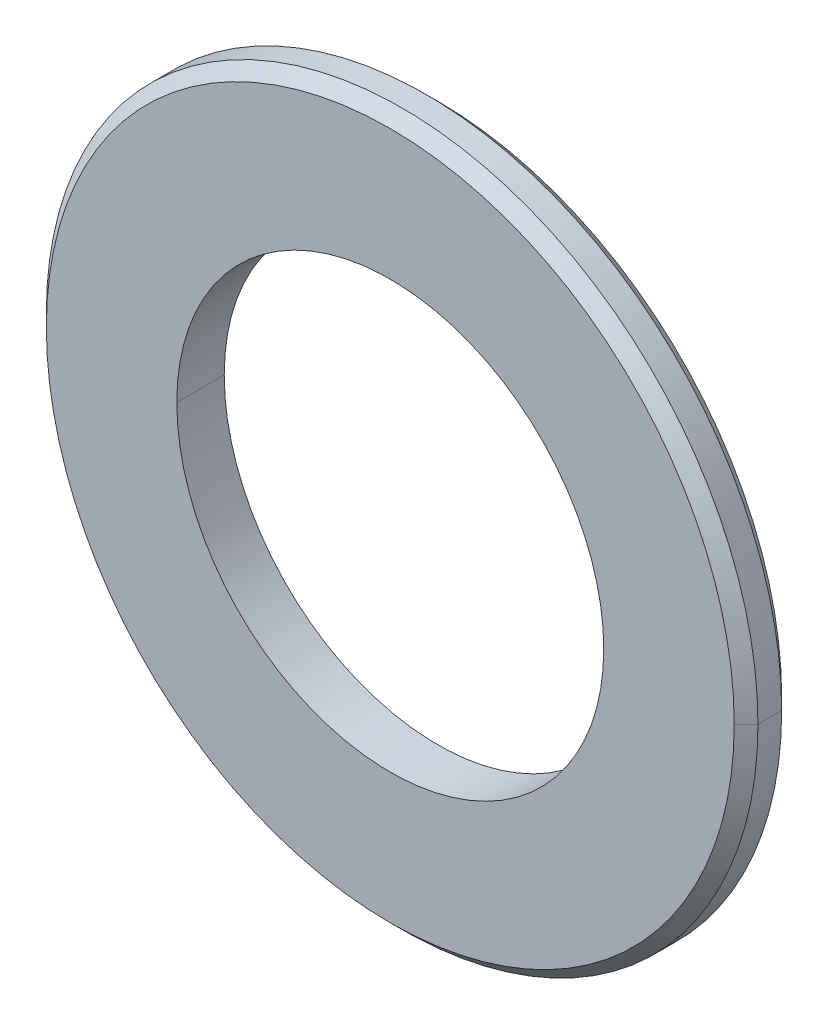
ISO-10303-21;
HEADER;
FILE_DESCRIPTION(('STEP AP214'),'2;1');
FILE_NAME('part.step','',(''),(''),'','','');
FILE_SCHEMA(('AUTOMOTIVE_DESIGN { 1 0 10303 214 1 1 1 1 }'));
ENDSEC;
DATA;
#1=APPLICATION_CONTEXT('core data for automotive mechanical design processes');
#2=APPLICATION_PROTOCOL_DEFINITION('international standard','automotive_design',2000,#1);
#3=PRODUCT_CONTEXT('',#1,'mechanical');
#4=PRODUCT('Part','Part','',(#3));
#5=PRODUCT_RELATED_PRODUCT_CATEGORY('part','',(#4));
#6=PRODUCT_DEFINITION_FORMATION('','',#4);
#7=PRODUCT_DEFINITION_CONTEXT('part definition',#1,'design');
#8=PRODUCT_DEFINITION('design','',#6,#7);
#9=PRODUCT_DEFINITION_SHAPE('','',#8);
#10=(LENGTH_UNIT() NAMED_UNIT(*) SI_UNIT(.MILLI.,.METRE.));
#11=(NAMED_UNIT(*) PLANE_ANGLE_UNIT() SI_UNIT($,.RADIAN.));
#12=(NAMED_UNIT(*) SI_UNIT($,.STERADIAN.) SOLID_ANGLE_UNIT());
#13=UNCERTAINTY_MEASURE_WITH_UNIT(LENGTH_MEASURE(1.E-05),#10,'distance_accuracy_value','');
#14=(GEOMETRIC_REPRESENTATION_CONTEXT(3) GLOBAL_UNCERTAINTY_ASSIGNED_CONTEXT((#13)) GLOBAL_UNIT_ASSIGNED_CONTEXT((#10,
#11,#12)) REPRESENTATION_CONTEXT('',''));
#15=CARTESIAN_POINT('',(0.,0.,0.));
#16=DIRECTION('',(0.,0.,1.));
#17=DIRECTION('',(1.,0.,0.));
#18=AXIS2_PLACEMENT_3D('',#15,#16,#17);
#19=CARTESIAN_POINT('',(0.,0.,1.));
#20=DIRECTION('',(0.,0.,-1.));
#21=DIRECTION('',(-1.,0.,0.));
#22=AXIS2_PLACEMENT_3D('',#19,#20,#21);
#23=CONICAL_SURFACE('',#22,7.25,0.785398163397443);
#24=DIRECTION('',(0.707106781186544,0.,-0.707106781186551));
#25=VECTOR('',#24,1.);
#26=CARTESIAN_POINT('',(7.25,0.,1.));
#27=LINE('',#26,#25);
#28=CARTESIAN_POINT('',(7.25,0.,1.));
#29=VERTEX_POINT('',#28);
#30=CARTESIAN_POINT('',(7.5,0.,0.75));
#31=VERTEX_POINT('',#30);
#32=EDGE_CURVE('E160',#29,#31,#27,.T.);
#33=ORIENTED_EDGE('',*,*,#32,.F.);
#34=CARTESIAN_POINT('',(0.,0.,1.));
#35=DIRECTION('',(0.,0.,1.));
#36=DIRECTION('',(1.,0.,0.));
#37=AXIS2_PLACEMENT_3D('',#34,#35,#36);
#38=CIRCLE('',#37,7.25);
#39=CARTESIAN_POINT('',(-7.25,0.,1.));
#40=VERTEX_POINT('',#39);
#41=EDGE_CURVE('E95',#40,#29,#38,.T.);
#42=ORIENTED_EDGE('',*,*,#41,.F.);
#43=DIRECTION('',(-0.707106781186544,0.,-0.707106781186551));
#44=VECTOR('',#43,1.);
#45=CARTESIAN_POINT('',(-7.25,0.,1.));
#46=LINE('',#45,#44);
#47=CARTESIAN_POINT('',(-7.5,0.,0.75));
#48=VERTEX_POINT('',#47);
#49=EDGE_CURVE('E149',#40,#48,#46,.T.);
#50=ORIENTED_EDGE('',*,*,#49,.T.);
#51=CARTESIAN_POINT('',(0.,0.,0.75));
#52=DIRECTION('',(0.,0.,-1.));
#53=DIRECTION('',(1.,0.,0.));
#54=AXIS2_PLACEMENT_3D('',#51,#52,#53);
#55=CIRCLE('',#54,7.5);
#56=EDGE_CURVE('E27',#31,#48,#55,.T.);
#57=ORIENTED_EDGE('',*,*,#56,.F.);
#58=EDGE_LOOP('',(#33,#42,#50,#57));
#59=FACE_BOUND('',#58,.T.);
#60=ADVANCED_FACE('F17',(#59),#23,.T.);
#61=CARTESIAN_POINT('',(0.,0.,0.25));
#62=DIRECTION('',(0.,0.,1.));
#63=DIRECTION('',(1.,0.,0.));
#64=AXIS2_PLACEMENT_3D('',#61,#62,#63);
#65=CONICAL_SURFACE('',#64,7.5,0.78539816339745);
#66=DIRECTION('',(-0.707106781186549,0.,0.707106781186546));
#67=VECTOR('',#66,1.);
#68=CARTESIAN_POINT('',(-7.5,0.,0.25));
#69=LINE('',#68,#67);
#70=CARTESIAN_POINT('',(-7.25,0.,0.));
#71=VERTEX_POINT('',#70);
#72=CARTESIAN_POINT('',(-7.5,0.,0.25));
#73=VERTEX_POINT('',#72);
#74=EDGE_CURVE('E166',#71,#73,#69,.T.);
#75=ORIENTED_EDGE('',*,*,#74,.F.);
#76=CARTESIAN_POINT('',(0.,0.,0.));
#77=DIRECTION('',(0.,0.,-1.));
#78=DIRECTION('',(1.,0.,0.));
#79=AXIS2_PLACEMENT_3D('',#76,#77,#78);
#80=CIRCLE('',#79,7.25);
#81=CARTESIAN_POINT('',(7.25,0.,0.));
#82=VERTEX_POINT('',#81);
#83=EDGE_CURVE('E93',#82,#71,#80,.T.);
#84=ORIENTED_EDGE('',*,*,#83,.F.);
#85=DIRECTION('',(0.707106781186549,0.,0.707106781186546));
#86=VECTOR('',#85,1.);
#87=CARTESIAN_POINT('',(7.5,0.,0.25));
#88=LINE('',#87,#86);
#89=CARTESIAN_POINT('',(7.5,0.,0.25));
#90=VERTEX_POINT('',#89);
#91=EDGE_CURVE('E104',#82,#90,#88,.T.);
#92=ORIENTED_EDGE('',*,*,#91,.T.);
#93=CARTESIAN_POINT('',(0.,0.,0.25));
#94=DIRECTION('',(0.,0.,1.));
#95=DIRECTION('',(1.,0.,0.));
#96=AXIS2_PLACEMENT_3D('',#93,#94,#95);
#97=CIRCLE('',#96,7.5);
#98=EDGE_CURVE('E11',#73,#90,#97,.T.);
#99=ORIENTED_EDGE('',*,*,#98,.F.);
#100=EDGE_LOOP('',(#75,#84,#92,#99));
#101=FACE_BOUND('',#100,.T.);
#102=ADVANCED_FACE('F254',(#101),#65,.T.);
#103=CARTESIAN_POINT('',(0.,0.,1.));
#104=DIRECTION('',(0.,0.,-1.));
#105=DIRECTION('',(-1.,0.,0.));
#106=AXIS2_PLACEMENT_3D('',#103,#104,#105);
#107=CYLINDRICAL_SURFACE('',#106,4.5);
#108=DIRECTION('',(0.,0.,-1.));
#109=VECTOR('',#108,1.);
#110=CARTESIAN_POINT('',(4.5,0.,1.));
#111=LINE('',#110,#109);
#112=CARTESIAN_POINT('',(4.5,0.,1.));
#113=VERTEX_POINT('',#112);
#114=CARTESIAN_POINT('',(4.5,0.,0.));
#115=VERTEX_POINT('',#114);
#116=EDGE_CURVE('E92',#113,#115,#111,.T.);
#117=ORIENTED_EDGE('',*,*,#116,.F.);
#118=CARTESIAN_POINT('',(0.,0.,1.));
#119=DIRECTION('',(0.,0.,1.));
#120=DIRECTION('',(1.,0.,0.));
#121=AXIS2_PLACEMENT_3D('',#118,#119,#120);
#122=CIRCLE('',#121,4.5);
#123=CARTESIAN_POINT('',(-4.5,0.,1.));
#124=VERTEX_POINT('',#123);
#125=EDGE_CURVE('E85',#113,#124,#122,.T.);
#126=ORIENTED_EDGE('',*,*,#125,.T.);
#127=DIRECTION('',(0.,0.,-1.));
#128=VECTOR('',#127,1.);
#129=CARTESIAN_POINT('',(-4.5,0.,1.));
#130=LINE('',#129,#128);
#131=CARTESIAN_POINT('',(-4.5,0.,0.));
#132=VERTEX_POINT('',#131);
#133=EDGE_CURVE('E103',#124,#132,#130,.T.);
#134=ORIENTED_EDGE('',*,*,#133,.T.);
#135=CARTESIAN_POINT('',(0.,0.,0.));
#136=DIRECTION('',(0.,0.,1.));
#137=DIRECTION('',(1.,0.,0.));
#138=AXIS2_PLACEMENT_3D('',#135,#136,#137);
#139=CIRCLE('',#138,4.5);
#140=EDGE_CURVE('E36',#115,#132,#139,.T.);
#141=ORIENTED_EDGE('',*,*,#140,.F.);
#142=EDGE_LOOP('',(#117,#126,#134,#141));
#143=FACE_BOUND('',#142,.T.);
#144=ADVANCED_FACE('F96',(#143),#107,.F.);
#145=CARTESIAN_POINT('',(0.,0.,1.));
#146=DIRECTION('',(0.,0.,-1.));
#147=DIRECTION('',(-1.,0.,0.));
#148=AXIS2_PLACEMENT_3D('',#145,#146,#147);
#149=CYLINDRICAL_SURFACE('',#148,7.5);
#150=DIRECTION('',(0.,0.,-1.));
#151=VECTOR('',#150,1.);
#152=CARTESIAN_POINT('',(7.5,0.,1.));
#153=LINE('',#152,#151);
#154=EDGE_CURVE('E116',#31,#90,#153,.T.);
#155=ORIENTED_EDGE('',*,*,#154,.F.);
#156=ORIENTED_EDGE('',*,*,#56,.T.);
#157=DIRECTION('',(0.,0.,-1.));
#158=VECTOR('',#157,1.);
#159=CARTESIAN_POINT('',(-7.5,0.,1.));
#160=LINE('',#159,#158);
#161=EDGE_CURVE('E120',#48,#73,#160,.T.);
#162=ORIENTED_EDGE('',*,*,#161,.T.);
#163=ORIENTED_EDGE('',*,*,#98,.T.);
#164=EDGE_LOOP('',(#155,#156,#162,#163));
#165=FACE_BOUND('',#164,.T.);
#166=ADVANCED_FACE('F132',(#165),#149,.T.);
#167=CARTESIAN_POINT('',(0.,0.,0.));
#168=DIRECTION('',(0.,0.,1.));
#169=DIRECTION('',(1.,0.,0.));
#170=AXIS2_PLACEMENT_3D('',#167,#168,#169);
#171=PLANE('',#170);
#172=CARTESIAN_POINT('',(0.,0.,0.));
#173=DIRECTION('',(0.,0.,1.));
#174=DIRECTION('',(1.,0.,0.));
#175=AXIS2_PLACEMENT_3D('',#172,#173,#174);
#176=CIRCLE('',#175,4.5);
#177=EDGE_CURVE('E99',#132,#115,#176,.T.);
#178=ORIENTED_EDGE('',*,*,#177,.T.);
#179=ORIENTED_EDGE('',*,*,#140,.T.);
#180=EDGE_LOOP('',(#178,#179));
#181=FACE_BOUND('',#180,.T.);
#182=ORIENTED_EDGE('',*,*,#83,.T.);
#183=CARTESIAN_POINT('',(0.,0.,0.));
#184=DIRECTION('',(0.,0.,-1.));
#185=DIRECTION('',(1.,0.,0.));
#186=AXIS2_PLACEMENT_3D('',#183,#184,#185);
#187=CIRCLE('',#186,7.25);
#188=EDGE_CURVE('E152',#71,#82,#187,.T.);
#189=ORIENTED_EDGE('',*,*,#188,.T.);
#190=EDGE_LOOP('',(#182,#189));
#191=FACE_BOUND('',#190,.T.);
#192=ADVANCED_FACE('F230',(#181,#191),#171,.F.);
#193=CARTESIAN_POINT('',(0.,0.,1.));
#194=DIRECTION('',(0.,0.,1.));
#195=DIRECTION('',(1.,0.,0.));
#196=AXIS2_PLACEMENT_3D('',#193,#194,#195);
#197=PLANE('',#196);
#198=CARTESIAN_POINT('',(0.,0.,1.));
#199=DIRECTION('',(0.,0.,1.));
#200=DIRECTION('',(1.,0.,0.));
#201=AXIS2_PLACEMENT_3D('',#198,#199,#200);
#202=CIRCLE('',#201,4.5);
#203=EDGE_CURVE('E87',#124,#113,#202,.T.);
#204=ORIENTED_EDGE('',*,*,#203,.F.);
#205=ORIENTED_EDGE('',*,*,#125,.F.);
#206=EDGE_LOOP('',(#204,#205));
#207=FACE_BOUND('',#206,.T.);
#208=ORIENTED_EDGE('',*,*,#41,.T.);
#209=CARTESIAN_POINT('',(0.,0.,1.));
#210=DIRECTION('',(0.,0.,1.));
#211=DIRECTION('',(1.,0.,0.));
#212=AXIS2_PLACEMENT_3D('',#209,#210,#211);
#213=CIRCLE('',#212,7.25);
#214=EDGE_CURVE('E163',#29,#40,#213,.T.);
#215=ORIENTED_EDGE('',*,*,#214,.T.);
#216=EDGE_LOOP('',(#208,#215));
#217=FACE_BOUND('',#216,.T.);
#218=ADVANCED_FACE('F81',(#207,#217),#197,.T.);
#219=CARTESIAN_POINT('',(0.,0.,1.));
#220=DIRECTION('',(0.,0.,-1.));
#221=DIRECTION('',(-1.,0.,0.));
#222=AXIS2_PLACEMENT_3D('',#219,#220,#221);
#223=CYLINDRICAL_SURFACE('',#222,7.5);
#224=CARTESIAN_POINT('',(0.,0.,0.75));
#225=DIRECTION('',(0.,0.,-1.));
#226=DIRECTION('',(1.,0.,0.));
#227=AXIS2_PLACEMENT_3D('',#224,#225,#226);
#228=CIRCLE('',#227,7.5);
#229=EDGE_CURVE('E142',#48,#31,#228,.T.);
#230=ORIENTED_EDGE('',*,*,#229,.T.);
#231=ORIENTED_EDGE('',*,*,#154,.T.);
#232=CARTESIAN_POINT('',(0.,0.,0.25));
#233=DIRECTION('',(0.,0.,1.));
#234=DIRECTION('',(1.,0.,0.));
#235=AXIS2_PLACEMENT_3D('',#232,#233,#234);
#236=CIRCLE('',#235,7.5);
#237=EDGE_CURVE('E115',#90,#73,#236,.T.);
#238=ORIENTED_EDGE('',*,*,#237,.T.);
#239=ORIENTED_EDGE('',*,*,#161,.F.);
#240=EDGE_LOOP('',(#230,#231,#238,#239));
#241=FACE_BOUND('',#240,.T.);
#242=ADVANCED_FACE('F138',(#241),#223,.T.);
#243=CARTESIAN_POINT('',(0.,0.,1.));
#244=DIRECTION('',(0.,0.,-1.));
#245=DIRECTION('',(-1.,0.,0.));
#246=AXIS2_PLACEMENT_3D('',#243,#244,#245);
#247=CYLINDRICAL_SURFACE('',#246,4.5);
#248=ORIENTED_EDGE('',*,*,#203,.T.);
#249=ORIENTED_EDGE('',*,*,#116,.T.);
#250=ORIENTED_EDGE('',*,*,#177,.F.);
#251=ORIENTED_EDGE('',*,*,#133,.F.);
#252=EDGE_LOOP('',(#248,#249,#250,#251));
#253=FACE_BOUND('',#252,.T.);
#254=ADVANCED_FACE('F105',(#253),#247,.F.);
#255=CARTESIAN_POINT('',(0.,0.,0.25));
#256=DIRECTION('',(0.,0.,1.));
#257=DIRECTION('',(1.,0.,0.));
#258=AXIS2_PLACEMENT_3D('',#255,#256,#257);
#259=CONICAL_SURFACE('',#258,7.5,0.78539816339745);
#260=ORIENTED_EDGE('',*,*,#188,.F.);
#261=ORIENTED_EDGE('',*,*,#74,.T.);
#262=ORIENTED_EDGE('',*,*,#237,.F.);
#263=ORIENTED_EDGE('',*,*,#91,.F.);
#264=EDGE_LOOP('',(#260,#261,#262,#263));
#265=FACE_BOUND('',#264,.T.);
#266=ADVANCED_FACE('F220',(#265),#259,.T.);
#267=CARTESIAN_POINT('',(0.,0.,1.));
#268=DIRECTION('',(0.,0.,-1.));
#269=DIRECTION('',(-1.,0.,0.));
#270=AXIS2_PLACEMENT_3D('',#267,#268,#269);
#271=CONICAL_SURFACE('',#270,7.25,0.785398163397443);
#272=ORIENTED_EDGE('',*,*,#214,.F.);
#273=ORIENTED_EDGE('',*,*,#32,.T.);
#274=ORIENTED_EDGE('',*,*,#229,.F.);
#275=ORIENTED_EDGE('',*,*,#49,.F.);
#276=EDGE_LOOP('',(#272,#273,#274,#275));
#277=FACE_BOUND('',#276,.T.);
#278=ADVANCED_FACE('F156',(#277),#271,.T.);
#279=CLOSED_SHELL('',(#60,#102,#144,#166,#192,#218,#242,#254,#266,#278));
#280=MANIFOLD_SOLID_BREP('B1',#279);
#281=ADVANCED_BREP_SHAPE_REPRESENTATION('',(#18,#280),#14);
#282=SHAPE_DEFINITION_REPRESENTATION(#9,#281);
ENDSEC;
END-ISO-10303-21;
